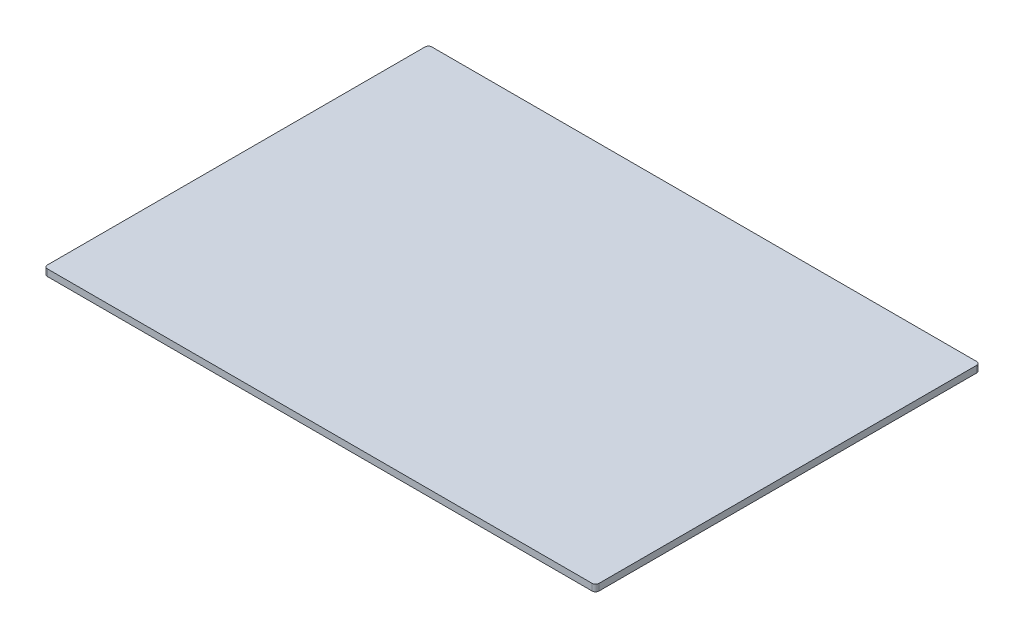
ISO-10303-21;
HEADER;
FILE_DESCRIPTION(('STEP AP214'),'2;1');
FILE_NAME('part.step','',(''),(''),'','','');
FILE_SCHEMA(('AUTOMOTIVE_DESIGN { 1 0 10303 214 1 1 1 1 }'));
ENDSEC;
DATA;
#1=APPLICATION_CONTEXT('core data for automotive mechanical design processes');
#2=APPLICATION_PROTOCOL_DEFINITION('international standard','automotive_design',2000,#1);
#3=PRODUCT_CONTEXT('',#1,'mechanical');
#4=PRODUCT('Part','Part','',(#3));
#5=PRODUCT_RELATED_PRODUCT_CATEGORY('part','',(#4));
#6=PRODUCT_DEFINITION_FORMATION('','',#4);
#7=PRODUCT_DEFINITION_CONTEXT('part definition',#1,'design');
#8=PRODUCT_DEFINITION('design','',#6,#7);
#9=PRODUCT_DEFINITION_SHAPE('','',#8);
#10=(LENGTH_UNIT() NAMED_UNIT(*) SI_UNIT(.MILLI.,.METRE.));
#11=(NAMED_UNIT(*) PLANE_ANGLE_UNIT() SI_UNIT($,.RADIAN.));
#12=(NAMED_UNIT(*) SI_UNIT($,.STERADIAN.) SOLID_ANGLE_UNIT());
#13=UNCERTAINTY_MEASURE_WITH_UNIT(LENGTH_MEASURE(1.E-05),#10,'distance_accuracy_value','');
#14=(GEOMETRIC_REPRESENTATION_CONTEXT(3) GLOBAL_UNCERTAINTY_ASSIGNED_CONTEXT((#13)) GLOBAL_UNIT_ASSIGNED_CONTEXT((#10,
#11,#12)) REPRESENTATION_CONTEXT('',''));
#15=CARTESIAN_POINT('',(0.,0.,0.));
#16=DIRECTION('',(0.,0.,1.));
#17=DIRECTION('',(1.,0.,0.));
#18=AXIS2_PLACEMENT_3D('',#15,#16,#17);
#19=CARTESIAN_POINT('',(82.5,2.,-57.5));
#20=DIRECTION('',(-1.,0.,0.));
#21=DIRECTION('',(0.,0.,1.));
#22=AXIS2_PLACEMENT_3D('',#19,#20,#21);
#23=PLANE('',#22);
#24=DIRECTION('',(0.,0.,-1.));
#25=VECTOR('',#24,1.);
#26=CARTESIAN_POINT('',(82.5,0.,-57.5));
#27=LINE('',#26,#25);
#28=CARTESIAN_POINT('',(82.5,0.,56.5));
#29=VERTEX_POINT('',#28);
#30=CARTESIAN_POINT('',(82.5,0.,-56.5));
#31=VERTEX_POINT('',#30);
#32=EDGE_CURVE('E134',#29,#31,#27,.T.);
#33=ORIENTED_EDGE('',*,*,#32,.T.);
#34=DIRECTION('',(0.,-1.,0.));
#35=VECTOR('',#34,1.);
#36=CARTESIAN_POINT('',(82.5,2.,-56.5));
#37=LINE('',#36,#35);
#38=CARTESIAN_POINT('',(82.5,2.,-56.5));
#39=VERTEX_POINT('',#38);
#40=EDGE_CURVE('E157',#31,#39,#37,.F.);
#41=ORIENTED_EDGE('',*,*,#40,.T.);
#42=DIRECTION('',(0.,0.,-1.));
#43=VECTOR('',#42,1.);
#44=CARTESIAN_POINT('',(82.5,2.,-57.5));
#45=LINE('',#44,#43);
#46=CARTESIAN_POINT('',(82.5,2.,56.5));
#47=VERTEX_POINT('',#46);
#48=EDGE_CURVE('E132',#47,#39,#45,.T.);
#49=ORIENTED_EDGE('',*,*,#48,.F.);
#50=DIRECTION('',(0.,-1.,0.));
#51=VECTOR('',#50,1.);
#52=CARTESIAN_POINT('',(82.5,2.,56.5));
#53=LINE('',#52,#51);
#54=EDGE_CURVE('E154',#47,#29,#53,.T.);
#55=ORIENTED_EDGE('',*,*,#54,.T.);
#56=EDGE_LOOP('',(#33,#41,#49,#55));
#57=FACE_BOUND('',#56,.T.);
#58=ADVANCED_FACE('F39',(#57),#23,.F.);
#59=CARTESIAN_POINT('',(-82.5,2.,-57.5));
#60=DIRECTION('',(0.,0.,1.));
#61=DIRECTION('',(1.,0.,0.));
#62=AXIS2_PLACEMENT_3D('',#59,#60,#61);
#63=PLANE('',#62);
#64=DIRECTION('',(-1.,0.,0.));
#65=VECTOR('',#64,1.);
#66=CARTESIAN_POINT('',(-82.5,0.,-57.5));
#67=LINE('',#66,#65);
#68=CARTESIAN_POINT('',(81.5,0.,-57.5));
#69=VERTEX_POINT('',#68);
#70=CARTESIAN_POINT('',(-81.5,0.,-57.5));
#71=VERTEX_POINT('',#70);
#72=EDGE_CURVE('E130',#69,#71,#67,.T.);
#73=ORIENTED_EDGE('',*,*,#72,.T.);
#74=DIRECTION('',(0.,-1.,0.));
#75=VECTOR('',#74,1.);
#76=CARTESIAN_POINT('',(-81.5,2.,-57.5));
#77=LINE('',#76,#75);
#78=CARTESIAN_POINT('',(-81.5,2.,-57.5));
#79=VERTEX_POINT('',#78);
#80=EDGE_CURVE('E109',#71,#79,#77,.F.);
#81=ORIENTED_EDGE('',*,*,#80,.T.);
#82=DIRECTION('',(-1.,0.,0.));
#83=VECTOR('',#82,1.);
#84=CARTESIAN_POINT('',(-82.5,2.,-57.5));
#85=LINE('',#84,#83);
#86=CARTESIAN_POINT('',(81.5,2.,-57.5));
#87=VERTEX_POINT('',#86);
#88=EDGE_CURVE('E173',#87,#79,#85,.T.);
#89=ORIENTED_EDGE('',*,*,#88,.F.);
#90=DIRECTION('',(0.,-1.,0.));
#91=VECTOR('',#90,1.);
#92=CARTESIAN_POINT('',(81.5,2.,-57.5));
#93=LINE('',#92,#91);
#94=EDGE_CURVE('E114',#87,#69,#93,.T.);
#95=ORIENTED_EDGE('',*,*,#94,.T.);
#96=EDGE_LOOP('',(#73,#81,#89,#95));
#97=FACE_BOUND('',#96,.T.);
#98=ADVANCED_FACE('F190',(#97),#63,.F.);
#99=CARTESIAN_POINT('',(-82.5,2.,-57.5));
#100=DIRECTION('',(1.,0.,0.));
#101=DIRECTION('',(0.,0.,-1.));
#102=AXIS2_PLACEMENT_3D('',#99,#100,#101);
#103=PLANE('',#102);
#104=DIRECTION('',(0.,0.,1.));
#105=VECTOR('',#104,1.);
#106=CARTESIAN_POINT('',(-82.5,2.,-57.5));
#107=LINE('',#106,#105);
#108=CARTESIAN_POINT('',(-82.5,2.,-56.5));
#109=VERTEX_POINT('',#108);
#110=CARTESIAN_POINT('',(-82.5,2.,56.5));
#111=VERTEX_POINT('',#110);
#112=EDGE_CURVE('E123',#109,#111,#107,.T.);
#113=ORIENTED_EDGE('',*,*,#112,.F.);
#114=DIRECTION('',(0.,-1.,0.));
#115=VECTOR('',#114,1.);
#116=CARTESIAN_POINT('',(-82.5,2.,-56.5));
#117=LINE('',#116,#115);
#118=CARTESIAN_POINT('',(-82.5,0.,-56.5));
#119=VERTEX_POINT('',#118);
#120=EDGE_CURVE('E108',#109,#119,#117,.T.);
#121=ORIENTED_EDGE('',*,*,#120,.T.);
#122=DIRECTION('',(0.,0.,1.));
#123=VECTOR('',#122,1.);
#124=CARTESIAN_POINT('',(-82.5,0.,-57.5));
#125=LINE('',#124,#123);
#126=CARTESIAN_POINT('',(-82.5,0.,56.5));
#127=VERTEX_POINT('',#126);
#128=EDGE_CURVE('E121',#119,#127,#125,.T.);
#129=ORIENTED_EDGE('',*,*,#128,.T.);
#130=DIRECTION('',(0.,-1.,0.));
#131=VECTOR('',#130,1.);
#132=CARTESIAN_POINT('',(-82.5,2.,56.5));
#133=LINE('',#132,#131);
#134=EDGE_CURVE('E125',#127,#111,#133,.F.);
#135=ORIENTED_EDGE('',*,*,#134,.T.);
#136=EDGE_LOOP('',(#113,#121,#129,#135));
#137=FACE_BOUND('',#136,.T.);
#138=ADVANCED_FACE('F120',(#137),#103,.F.);
#139=CARTESIAN_POINT('',(-82.5,2.,57.5));
#140=DIRECTION('',(0.,0.,-1.));
#141=DIRECTION('',(-1.,0.,0.));
#142=AXIS2_PLACEMENT_3D('',#139,#140,#141);
#143=PLANE('',#142);
#144=DIRECTION('',(1.,0.,0.));
#145=VECTOR('',#144,1.);
#146=CARTESIAN_POINT('',(-82.5,0.,57.5));
#147=LINE('',#146,#145);
#148=CARTESIAN_POINT('',(-81.5,0.,57.5));
#149=VERTEX_POINT('',#148);
#150=CARTESIAN_POINT('',(81.5,0.,57.5));
#151=VERTEX_POINT('',#150);
#152=EDGE_CURVE('E129',#149,#151,#147,.T.);
#153=ORIENTED_EDGE('',*,*,#152,.T.);
#154=DIRECTION('',(0.,-1.,0.));
#155=VECTOR('',#154,1.);
#156=CARTESIAN_POINT('',(81.5,2.,57.5));
#157=LINE('',#156,#155);
#158=CARTESIAN_POINT('',(81.5,2.,57.5));
#159=VERTEX_POINT('',#158);
#160=EDGE_CURVE('E11',#151,#159,#157,.F.);
#161=ORIENTED_EDGE('',*,*,#160,.T.);
#162=DIRECTION('',(1.,0.,0.));
#163=VECTOR('',#162,1.);
#164=CARTESIAN_POINT('',(-82.5,2.,57.5));
#165=LINE('',#164,#163);
#166=CARTESIAN_POINT('',(-81.5,2.,57.5));
#167=VERTEX_POINT('',#166);
#168=EDGE_CURVE('E138',#167,#159,#165,.T.);
#169=ORIENTED_EDGE('',*,*,#168,.F.);
#170=DIRECTION('',(0.,-1.,0.));
#171=VECTOR('',#170,1.);
#172=CARTESIAN_POINT('',(-81.5,2.,57.5));
#173=LINE('',#172,#171);
#174=EDGE_CURVE('E47',#167,#149,#173,.T.);
#175=ORIENTED_EDGE('',*,*,#174,.T.);
#176=EDGE_LOOP('',(#153,#161,#169,#175));
#177=FACE_BOUND('',#176,.T.);
#178=ADVANCED_FACE('F160',(#177),#143,.F.);
#179=CARTESIAN_POINT('',(0.,2.,0.));
#180=DIRECTION('',(0.,1.,0.));
#181=DIRECTION('',(0.,0.,1.));
#182=AXIS2_PLACEMENT_3D('',#179,#180,#181);
#183=PLANE('',#182);
#184=ORIENTED_EDGE('',*,*,#88,.T.);
#185=CARTESIAN_POINT('',(-81.5,2.,-56.5));
#186=DIRECTION('',(0.,1.,0.));
#187=DIRECTION('',(0.,0.,1.));
#188=AXIS2_PLACEMENT_3D('',#185,#186,#187);
#189=CIRCLE('',#188,1.);
#190=EDGE_CURVE('E152',#79,#109,#189,.T.);
#191=ORIENTED_EDGE('',*,*,#190,.T.);
#192=ORIENTED_EDGE('',*,*,#112,.T.);
#193=CARTESIAN_POINT('',(-81.5,2.,56.5));
#194=DIRECTION('',(0.,1.,0.));
#195=DIRECTION('',(0.,0.,1.));
#196=AXIS2_PLACEMENT_3D('',#193,#194,#195);
#197=CIRCLE('',#196,1.);
#198=EDGE_CURVE('E59',#111,#167,#197,.T.);
#199=ORIENTED_EDGE('',*,*,#198,.T.);
#200=ORIENTED_EDGE('',*,*,#168,.T.);
#201=CARTESIAN_POINT('',(81.5,2.,56.5));
#202=DIRECTION('',(0.,1.,0.));
#203=DIRECTION('',(0.,0.,1.));
#204=AXIS2_PLACEMENT_3D('',#201,#202,#203);
#205=CIRCLE('',#204,1.);
#206=EDGE_CURVE('E148',#159,#47,#205,.T.);
#207=ORIENTED_EDGE('',*,*,#206,.T.);
#208=ORIENTED_EDGE('',*,*,#48,.T.);
#209=CARTESIAN_POINT('',(81.5,2.,-56.5));
#210=DIRECTION('',(0.,1.,0.));
#211=DIRECTION('',(0.,0.,1.));
#212=AXIS2_PLACEMENT_3D('',#209,#210,#211);
#213=CIRCLE('',#212,1.);
#214=EDGE_CURVE('E150',#39,#87,#213,.T.);
#215=ORIENTED_EDGE('',*,*,#214,.T.);
#216=EDGE_LOOP('',(#184,#191,#192,#199,#200,#207,#208,#215));
#217=FACE_BOUND('',#216,.T.);
#218=ADVANCED_FACE('F179',(#217),#183,.T.);
#219=CARTESIAN_POINT('',(0.,0.,0.));
#220=DIRECTION('',(0.,1.,0.));
#221=DIRECTION('',(0.,0.,1.));
#222=AXIS2_PLACEMENT_3D('',#219,#220,#221);
#223=PLANE('',#222);
#224=ORIENTED_EDGE('',*,*,#128,.F.);
#225=CARTESIAN_POINT('',(-81.5,0.,-56.5));
#226=DIRECTION('',(0.,1.,0.));
#227=DIRECTION('',(0.,0.,1.));
#228=AXIS2_PLACEMENT_3D('',#225,#226,#227);
#229=CIRCLE('',#228,1.);
#230=EDGE_CURVE('E104',#119,#71,#229,.F.);
#231=ORIENTED_EDGE('',*,*,#230,.T.);
#232=ORIENTED_EDGE('',*,*,#72,.F.);
#233=CARTESIAN_POINT('',(81.5,0.,-56.5));
#234=DIRECTION('',(0.,1.,0.));
#235=DIRECTION('',(0.,0.,1.));
#236=AXIS2_PLACEMENT_3D('',#233,#234,#235);
#237=CIRCLE('',#236,1.);
#238=EDGE_CURVE('E115',#69,#31,#237,.F.);
#239=ORIENTED_EDGE('',*,*,#238,.T.);
#240=ORIENTED_EDGE('',*,*,#32,.F.);
#241=CARTESIAN_POINT('',(81.5,0.,56.5));
#242=DIRECTION('',(0.,1.,0.));
#243=DIRECTION('',(0.,0.,1.));
#244=AXIS2_PLACEMENT_3D('',#241,#242,#243);
#245=CIRCLE('',#244,1.);
#246=EDGE_CURVE('E141',#29,#151,#245,.F.);
#247=ORIENTED_EDGE('',*,*,#246,.T.);
#248=ORIENTED_EDGE('',*,*,#152,.F.);
#249=CARTESIAN_POINT('',(-81.5,0.,56.5));
#250=DIRECTION('',(0.,1.,0.));
#251=DIRECTION('',(0.,0.,1.));
#252=AXIS2_PLACEMENT_3D('',#249,#250,#251);
#253=CIRCLE('',#252,1.);
#254=EDGE_CURVE('E124',#149,#127,#253,.F.);
#255=ORIENTED_EDGE('',*,*,#254,.T.);
#256=EDGE_LOOP('',(#224,#231,#232,#239,#240,#247,#248,#255));
#257=FACE_BOUND('',#256,.T.);
#258=ADVANCED_FACE('F127',(#257),#223,.F.);
#259=CARTESIAN_POINT('',(-81.5,2.,-56.5));
#260=DIRECTION('',(0.,-1.,0.));
#261=DIRECTION('',(0.,0.,-1.));
#262=AXIS2_PLACEMENT_3D('',#259,#260,#261);
#263=CYLINDRICAL_SURFACE('',#262,1.);
#264=ORIENTED_EDGE('',*,*,#190,.F.);
#265=ORIENTED_EDGE('',*,*,#80,.F.);
#266=ORIENTED_EDGE('',*,*,#230,.F.);
#267=ORIENTED_EDGE('',*,*,#120,.F.);
#268=EDGE_LOOP('',(#264,#265,#266,#267));
#269=FACE_BOUND('',#268,.T.);
#270=ADVANCED_FACE('F107',(#269),#263,.T.);
#271=CARTESIAN_POINT('',(81.5,2.,-56.5));
#272=DIRECTION('',(0.,-1.,0.));
#273=DIRECTION('',(0.,0.,-1.));
#274=AXIS2_PLACEMENT_3D('',#271,#272,#273);
#275=CYLINDRICAL_SURFACE('',#274,1.);
#276=ORIENTED_EDGE('',*,*,#214,.F.);
#277=ORIENTED_EDGE('',*,*,#40,.F.);
#278=ORIENTED_EDGE('',*,*,#238,.F.);
#279=ORIENTED_EDGE('',*,*,#94,.F.);
#280=EDGE_LOOP('',(#276,#277,#278,#279));
#281=FACE_BOUND('',#280,.T.);
#282=ADVANCED_FACE('F201',(#281),#275,.T.);
#283=CARTESIAN_POINT('',(81.5,2.,56.5));
#284=DIRECTION('',(0.,-1.,0.));
#285=DIRECTION('',(0.,0.,-1.));
#286=AXIS2_PLACEMENT_3D('',#283,#284,#285);
#287=CYLINDRICAL_SURFACE('',#286,1.);
#288=ORIENTED_EDGE('',*,*,#206,.F.);
#289=ORIENTED_EDGE('',*,*,#160,.F.);
#290=ORIENTED_EDGE('',*,*,#246,.F.);
#291=ORIENTED_EDGE('',*,*,#54,.F.);
#292=EDGE_LOOP('',(#288,#289,#290,#291));
#293=FACE_BOUND('',#292,.T.);
#294=ADVANCED_FACE('F167',(#293),#287,.T.);
#295=CARTESIAN_POINT('',(-81.5,2.,56.5));
#296=DIRECTION('',(0.,-1.,0.));
#297=DIRECTION('',(0.,0.,-1.));
#298=AXIS2_PLACEMENT_3D('',#295,#296,#297);
#299=CYLINDRICAL_SURFACE('',#298,1.);
#300=ORIENTED_EDGE('',*,*,#198,.F.);
#301=ORIENTED_EDGE('',*,*,#134,.F.);
#302=ORIENTED_EDGE('',*,*,#254,.F.);
#303=ORIENTED_EDGE('',*,*,#174,.F.);
#304=EDGE_LOOP('',(#300,#301,#302,#303));
#305=FACE_BOUND('',#304,.T.);
#306=ADVANCED_FACE('F41',(#305),#299,.T.);
#307=CLOSED_SHELL('',(#58,#98,#138,#178,#218,#258,#270,#282,#294,#306));
#308=MANIFOLD_SOLID_BREP('B2',#307);
#309=ADVANCED_BREP_SHAPE_REPRESENTATION('',(#18,#308),#14);
#310=SHAPE_DEFINITION_REPRESENTATION(#9,#309);
ENDSEC;
END-ISO-10303-21;
